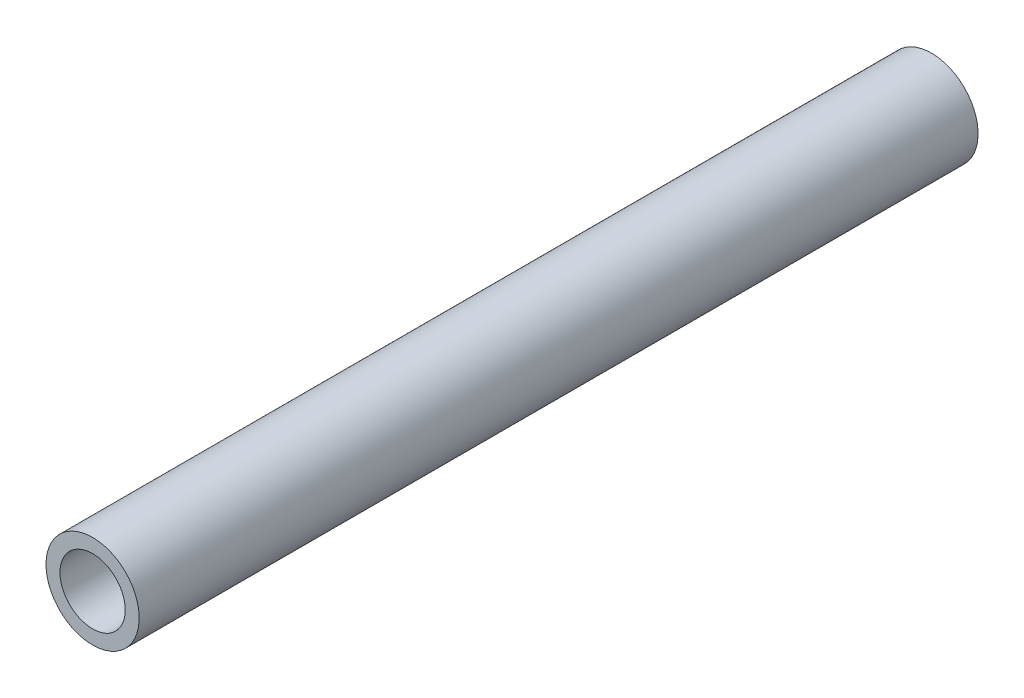
ISO-10303-21;
HEADER;
FILE_DESCRIPTION(('STEP AP214'),'2;1');
FILE_NAME('part.step','',(''),(''),'','','');
FILE_SCHEMA(('AUTOMOTIVE_DESIGN { 1 0 10303 214 1 1 1 1 }'));
ENDSEC;
DATA;
#1=APPLICATION_CONTEXT('core data for automotive mechanical design processes');
#2=APPLICATION_PROTOCOL_DEFINITION('international standard','automotive_design',2000,#1);
#3=PRODUCT_CONTEXT('',#1,'mechanical');
#4=PRODUCT('Part','Part','',(#3));
#5=PRODUCT_RELATED_PRODUCT_CATEGORY('part','',(#4));
#6=PRODUCT_DEFINITION_FORMATION('','',#4);
#7=PRODUCT_DEFINITION_CONTEXT('part definition',#1,'design');
#8=PRODUCT_DEFINITION('design','',#6,#7);
#9=PRODUCT_DEFINITION_SHAPE('','',#8);
#10=(LENGTH_UNIT() NAMED_UNIT(*) SI_UNIT(.MILLI.,.METRE.));
#11=(NAMED_UNIT(*) PLANE_ANGLE_UNIT() SI_UNIT($,.RADIAN.));
#12=(NAMED_UNIT(*) SI_UNIT($,.STERADIAN.) SOLID_ANGLE_UNIT());
#13=UNCERTAINTY_MEASURE_WITH_UNIT(LENGTH_MEASURE(1.E-05),#10,'distance_accuracy_value','');
#14=(GEOMETRIC_REPRESENTATION_CONTEXT(3) GLOBAL_UNCERTAINTY_ASSIGNED_CONTEXT((#13)) GLOBAL_UNIT_ASSIGNED_CONTEXT((#10,
#11,#12)) REPRESENTATION_CONTEXT('',''));
#15=CARTESIAN_POINT('',(0.,0.,0.));
#16=DIRECTION('',(0.,0.,1.));
#17=DIRECTION('',(1.,0.,0.));
#18=AXIS2_PLACEMENT_3D('',#15,#16,#17);
#19=CARTESIAN_POINT('',(0.,0.,90.));
#20=DIRECTION('',(0.,0.,1.));
#21=DIRECTION('',(1.,0.,0.));
#22=AXIS2_PLACEMENT_3D('',#19,#20,#21);
#23=PLANE('',#22);
#24=CARTESIAN_POINT('',(0.,0.,90.));
#25=DIRECTION('',(0.,0.,1.));
#26=DIRECTION('',(1.,0.,0.));
#27=AXIS2_PLACEMENT_3D('',#24,#25,#26);
#28=CIRCLE('',#27,5.);
#29=CARTESIAN_POINT('',(-5.,0.,90.));
#30=VERTEX_POINT('',#29);
#31=EDGE_CURVE('E10',#30,#30,#28,.T.);
#32=ORIENTED_EDGE('',*,*,#31,.T.);
#33=EDGE_LOOP('',(#32));
#34=FACE_BOUND('',#33,.T.);
#35=CARTESIAN_POINT('',(0.,0.,90.));
#36=DIRECTION('',(0.,0.,1.));
#37=DIRECTION('',(1.,0.,0.));
#38=AXIS2_PLACEMENT_3D('',#35,#36,#37);
#39=CIRCLE('',#38,3.5);
#40=CARTESIAN_POINT('',(-3.5,0.,90.));
#41=VERTEX_POINT('',#40);
#42=EDGE_CURVE('E52',#41,#41,#39,.T.);
#43=ORIENTED_EDGE('',*,*,#42,.F.);
#44=EDGE_LOOP('',(#43));
#45=FACE_BOUND('',#44,.T.);
#46=ADVANCED_FACE('F39',(#34,#45),#23,.T.);
#47=CARTESIAN_POINT('',(0.,0.,0.));
#48=DIRECTION('',(0.,0.,1.));
#49=DIRECTION('',(1.,0.,0.));
#50=AXIS2_PLACEMENT_3D('',#47,#48,#49);
#51=PLANE('',#50);
#52=CARTESIAN_POINT('',(0.,0.,0.));
#53=DIRECTION('',(0.,0.,1.));
#54=DIRECTION('',(1.,0.,0.));
#55=AXIS2_PLACEMENT_3D('',#52,#53,#54);
#56=CIRCLE('',#55,5.);
#57=CARTESIAN_POINT('',(-5.,0.,0.));
#58=VERTEX_POINT('',#57);
#59=EDGE_CURVE('E43',#58,#58,#56,.T.);
#60=ORIENTED_EDGE('',*,*,#59,.F.);
#61=EDGE_LOOP('',(#60));
#62=FACE_BOUND('',#61,.T.);
#63=CARTESIAN_POINT('',(0.,0.,0.));
#64=DIRECTION('',(0.,0.,1.));
#65=DIRECTION('',(1.,0.,0.));
#66=AXIS2_PLACEMENT_3D('',#63,#64,#65);
#67=CIRCLE('',#66,3.5);
#68=CARTESIAN_POINT('',(-3.5,0.,0.));
#69=VERTEX_POINT('',#68);
#70=EDGE_CURVE('E54',#69,#69,#67,.T.);
#71=ORIENTED_EDGE('',*,*,#70,.T.);
#72=EDGE_LOOP('',(#71));
#73=FACE_BOUND('',#72,.T.);
#74=ADVANCED_FACE('F66',(#62,#73),#51,.F.);
#75=CARTESIAN_POINT('',(0.,0.,90.));
#76=DIRECTION('',(0.,0.,-1.));
#77=DIRECTION('',(-1.,0.,0.));
#78=AXIS2_PLACEMENT_3D('',#75,#76,#77);
#79=CYLINDRICAL_SURFACE('',#78,5.);
#80=CARTESIAN_POINT('',(-5.,0.,90.));
#81=CARTESIAN_POINT('',(-5.,0.,89.0625));
#82=CARTESIAN_POINT('',(-5.,0.,88.125));
#83=CARTESIAN_POINT('',(-5.,0.,86.25));
#84=CARTESIAN_POINT('',(-5.,0.,85.3125));
#85=CARTESIAN_POINT('',(-5.,0.,83.4375));
#86=CARTESIAN_POINT('',(-5.,0.,82.5));
#87=CARTESIAN_POINT('',(-5.,0.,80.625));
#88=CARTESIAN_POINT('',(-5.,0.,79.6875));
#89=CARTESIAN_POINT('',(-5.,0.,77.8125));
#90=CARTESIAN_POINT('',(-5.,0.,76.875));
#91=CARTESIAN_POINT('',(-5.,0.,75.));
#92=CARTESIAN_POINT('',(-5.,0.,74.0625));
#93=CARTESIAN_POINT('',(-5.,0.,72.1875));
#94=CARTESIAN_POINT('',(-5.,0.,71.25));
#95=CARTESIAN_POINT('',(-5.,0.,69.375));
#96=CARTESIAN_POINT('',(-5.,0.,68.4375));
#97=CARTESIAN_POINT('',(-5.,0.,66.5625));
#98=CARTESIAN_POINT('',(-5.,0.,65.625));
#99=CARTESIAN_POINT('',(-5.,0.,63.75));
#100=CARTESIAN_POINT('',(-5.,0.,62.8125));
#101=CARTESIAN_POINT('',(-5.,0.,60.9375));
#102=CARTESIAN_POINT('',(-5.,0.,60.));
#103=CARTESIAN_POINT('',(-5.,0.,58.125));
#104=CARTESIAN_POINT('',(-5.,0.,57.1875));
#105=CARTESIAN_POINT('',(-5.,0.,55.3125));
#106=CARTESIAN_POINT('',(-5.,0.,54.375));
#107=CARTESIAN_POINT('',(-5.,0.,52.5));
#108=CARTESIAN_POINT('',(-5.,0.,51.5625));
#109=CARTESIAN_POINT('',(-5.,0.,49.6875));
#110=CARTESIAN_POINT('',(-5.,0.,48.75));
#111=CARTESIAN_POINT('',(-5.,0.,46.875));
#112=CARTESIAN_POINT('',(-5.,0.,45.9375));
#113=CARTESIAN_POINT('',(-5.,0.,44.0625));
#114=CARTESIAN_POINT('',(-5.,0.,43.125));
#115=CARTESIAN_POINT('',(-5.,0.,41.25));
#116=CARTESIAN_POINT('',(-5.,0.,40.3125));
#117=CARTESIAN_POINT('',(-5.,0.,38.4375));
#118=CARTESIAN_POINT('',(-5.,0.,37.5));
#119=CARTESIAN_POINT('',(-5.,0.,35.625));
#120=CARTESIAN_POINT('',(-5.,0.,34.6875));
#121=CARTESIAN_POINT('',(-5.,0.,32.8125));
#122=CARTESIAN_POINT('',(-5.,0.,31.875));
#123=CARTESIAN_POINT('',(-5.,0.,30.));
#124=CARTESIAN_POINT('',(-5.,0.,29.0625));
#125=CARTESIAN_POINT('',(-5.,0.,27.1875));
#126=CARTESIAN_POINT('',(-5.,0.,26.25));
#127=CARTESIAN_POINT('',(-5.,0.,24.375));
#128=CARTESIAN_POINT('',(-5.,0.,23.4375));
#129=CARTESIAN_POINT('',(-5.,0.,21.5625));
#130=CARTESIAN_POINT('',(-5.,0.,20.625));
#131=CARTESIAN_POINT('',(-5.,0.,18.75));
#132=CARTESIAN_POINT('',(-5.,0.,17.8125));
#133=CARTESIAN_POINT('',(-5.,0.,15.9375));
#134=CARTESIAN_POINT('',(-5.,0.,15.));
#135=CARTESIAN_POINT('',(-5.,0.,13.125));
#136=CARTESIAN_POINT('',(-5.,0.,12.1875));
#137=CARTESIAN_POINT('',(-5.,0.,10.3125));
#138=CARTESIAN_POINT('',(-5.,0.,9.37499999999999));
#139=CARTESIAN_POINT('',(-5.,0.,7.49999999999999));
#140=CARTESIAN_POINT('',(-5.,0.,6.56249999999999));
#141=CARTESIAN_POINT('',(-5.,0.,4.68749999999999));
#142=CARTESIAN_POINT('',(-5.,0.,3.74999999999998));
#143=CARTESIAN_POINT('',(-5.,0.,1.87499999999998));
#144=CARTESIAN_POINT('',(-5.,0.,0.937499999999986));
#145=CARTESIAN_POINT('',(-5.,0.,0.));
#146=B_SPLINE_CURVE_WITH_KNOTS('',3,(#80,#81,#82,#83,#84,#85,#86,#87,#88,#89,#90,#91,#92,#93,
#94,#95,#96,#97,#98,#99,#100,#101,#102,#103,#104,#105,#106,#107,#108,#109,#110,#111,#112,#113,
#114,#115,#116,#117,#118,#119,#120,#121,#122,#123,#124,#125,#126,#127,#128,#129,#130,#131,#132,
#133,#134,#135,#136,#137,#138,#139,#140,#141,#142,#143,#144,#145),.UNSPECIFIED.,.F.,.F.,(4,2,2,
2,2,2,2,2,2,2,2,2,2,2,2,2,2,2,2,2,2,2,2,2,2,2,2,2,2,2,2,2,4),(0.,2.8125,5.62499999999999,
8.43749999999999,11.25,14.0625,16.875,19.6875,22.5,25.3125,28.125,30.9375,33.75,36.5625,39.375,
42.1875,45.,47.8125,50.625,53.4375,56.25,59.0625,61.875,64.6875,67.5,70.3125,73.125,75.9375,
78.75,81.5625,84.375,87.1875,90.),.UNSPECIFIED.);
#147=EDGE_CURVE('BSEAM41',#30,#58,#146,.T.);
#148=ORIENTED_EDGE('',*,*,#31,.F.);
#149=ORIENTED_EDGE('',*,*,#59,.T.);
#150=ORIENTED_EDGE('',*,*,#147,.T.);
#151=ORIENTED_EDGE('',*,*,#147,.F.);
#152=EDGE_LOOP('',(#148,#150,#149,#151));
#153=FACE_BOUND('',#152,.T.);
#154=ADVANCED_FACE('F41',(#153),#79,.T.);
#155=CARTESIAN_POINT('',(0.,0.,90.));
#156=DIRECTION('',(0.,0.,-1.));
#157=DIRECTION('',(-1.,0.,0.));
#158=AXIS2_PLACEMENT_3D('',#155,#156,#157);
#159=CYLINDRICAL_SURFACE('',#158,3.5);
#160=CARTESIAN_POINT('',(-3.5,0.,90.));
#161=CARTESIAN_POINT('',(-3.5,0.,89.0625));
#162=CARTESIAN_POINT('',(-3.5,0.,88.125));
#163=CARTESIAN_POINT('',(-3.5,0.,86.25));
#164=CARTESIAN_POINT('',(-3.5,0.,85.3125));
#165=CARTESIAN_POINT('',(-3.5,0.,83.4375));
#166=CARTESIAN_POINT('',(-3.5,0.,82.5));
#167=CARTESIAN_POINT('',(-3.5,0.,80.625));
#168=CARTESIAN_POINT('',(-3.5,0.,79.6875));
#169=CARTESIAN_POINT('',(-3.5,0.,77.8125));
#170=CARTESIAN_POINT('',(-3.5,0.,76.875));
#171=CARTESIAN_POINT('',(-3.5,0.,75.));
#172=CARTESIAN_POINT('',(-3.5,0.,74.0625));
#173=CARTESIAN_POINT('',(-3.5,0.,72.1875));
#174=CARTESIAN_POINT('',(-3.5,0.,71.25));
#175=CARTESIAN_POINT('',(-3.5,0.,69.375));
#176=CARTESIAN_POINT('',(-3.5,0.,68.4375));
#177=CARTESIAN_POINT('',(-3.5,0.,66.5625));
#178=CARTESIAN_POINT('',(-3.5,0.,65.625));
#179=CARTESIAN_POINT('',(-3.5,0.,63.75));
#180=CARTESIAN_POINT('',(-3.5,0.,62.8125));
#181=CARTESIAN_POINT('',(-3.5,0.,60.9375));
#182=CARTESIAN_POINT('',(-3.5,0.,60.));
#183=CARTESIAN_POINT('',(-3.5,0.,58.125));
#184=CARTESIAN_POINT('',(-3.5,0.,57.1875));
#185=CARTESIAN_POINT('',(-3.5,0.,55.3125));
#186=CARTESIAN_POINT('',(-3.5,0.,54.375));
#187=CARTESIAN_POINT('',(-3.5,0.,52.5));
#188=CARTESIAN_POINT('',(-3.5,0.,51.5625));
#189=CARTESIAN_POINT('',(-3.5,0.,49.6875));
#190=CARTESIAN_POINT('',(-3.5,0.,48.75));
#191=CARTESIAN_POINT('',(-3.5,0.,46.875));
#192=CARTESIAN_POINT('',(-3.5,0.,45.9375));
#193=CARTESIAN_POINT('',(-3.5,0.,44.0625));
#194=CARTESIAN_POINT('',(-3.5,0.,43.125));
#195=CARTESIAN_POINT('',(-3.5,0.,41.25));
#196=CARTESIAN_POINT('',(-3.5,0.,40.3125));
#197=CARTESIAN_POINT('',(-3.5,0.,38.4375));
#198=CARTESIAN_POINT('',(-3.5,0.,37.5));
#199=CARTESIAN_POINT('',(-3.5,0.,35.625));
#200=CARTESIAN_POINT('',(-3.5,0.,34.6875));
#201=CARTESIAN_POINT('',(-3.5,0.,32.8125));
#202=CARTESIAN_POINT('',(-3.5,0.,31.875));
#203=CARTESIAN_POINT('',(-3.5,0.,30.));
#204=CARTESIAN_POINT('',(-3.5,0.,29.0625));
#205=CARTESIAN_POINT('',(-3.5,0.,27.1875));
#206=CARTESIAN_POINT('',(-3.5,0.,26.25));
#207=CARTESIAN_POINT('',(-3.5,0.,24.375));
#208=CARTESIAN_POINT('',(-3.5,0.,23.4375));
#209=CARTESIAN_POINT('',(-3.5,0.,21.5625));
#210=CARTESIAN_POINT('',(-3.5,0.,20.625));
#211=CARTESIAN_POINT('',(-3.5,0.,18.75));
#212=CARTESIAN_POINT('',(-3.5,0.,17.8125));
#213=CARTESIAN_POINT('',(-3.5,0.,15.9375));
#214=CARTESIAN_POINT('',(-3.5,0.,15.));
#215=CARTESIAN_POINT('',(-3.5,0.,13.125));
#216=CARTESIAN_POINT('',(-3.5,0.,12.1875));
#217=CARTESIAN_POINT('',(-3.5,0.,10.3125));
#218=CARTESIAN_POINT('',(-3.5,0.,9.37499999999999));
#219=CARTESIAN_POINT('',(-3.5,0.,7.49999999999999));
#220=CARTESIAN_POINT('',(-3.5,0.,6.56249999999999));
#221=CARTESIAN_POINT('',(-3.5,0.,4.68749999999999));
#222=CARTESIAN_POINT('',(-3.5,0.,3.74999999999998));
#223=CARTESIAN_POINT('',(-3.5,0.,1.87499999999998));
#224=CARTESIAN_POINT('',(-3.5,0.,0.937499999999986));
#225=CARTESIAN_POINT('',(-3.5,0.,0.));
#226=B_SPLINE_CURVE_WITH_KNOTS('',3,(#160,#161,#162,#163,#164,#165,#166,#167,#168,#169,#170,
#171,#172,#173,#174,#175,#176,#177,#178,#179,#180,#181,#182,#183,#184,#185,#186,#187,#188,#189,
#190,#191,#192,#193,#194,#195,#196,#197,#198,#199,#200,#201,#202,#203,#204,#205,#206,#207,#208,
#209,#210,#211,#212,#213,#214,#215,#216,#217,#218,#219,#220,#221,#222,#223,#224,#225),
.UNSPECIFIED.,.F.,.F.,(4,2,2,2,2,2,2,2,2,2,2,2,2,2,2,2,2,2,2,2,2,2,2,2,2,2,2,2,2,2,2,2,4),(0.,
2.8125,5.62499999999999,8.43749999999999,11.25,14.0625,16.875,19.6875,22.5,25.3125,28.125,
30.9375,33.75,36.5625,39.375,42.1875,45.,47.8125,50.625,53.4375,56.25,59.0625,61.875,64.6875,
67.5,70.3125,73.125,75.9375,78.75,81.5625,84.375,87.1875,90.),.UNSPECIFIED.);
#227=EDGE_CURVE('BSEAM62',#41,#69,#226,.T.);
#228=ORIENTED_EDGE('',*,*,#42,.T.);
#229=ORIENTED_EDGE('',*,*,#70,.F.);
#230=ORIENTED_EDGE('',*,*,#227,.T.);
#231=ORIENTED_EDGE('',*,*,#227,.F.);
#232=EDGE_LOOP('',(#228,#230,#229,#231));
#233=FACE_BOUND('',#232,.T.);
#234=ADVANCED_FACE('F62',(#233),#159,.F.);
#235=CLOSED_SHELL('',(#46,#74,#154,#234));
#236=MANIFOLD_SOLID_BREP('B2',#235);
#237=ADVANCED_BREP_SHAPE_REPRESENTATION('',(#18,#236),#14);
#238=SHAPE_DEFINITION_REPRESENTATION(#9,#237);
ENDSEC;
END-ISO-10303-21;
